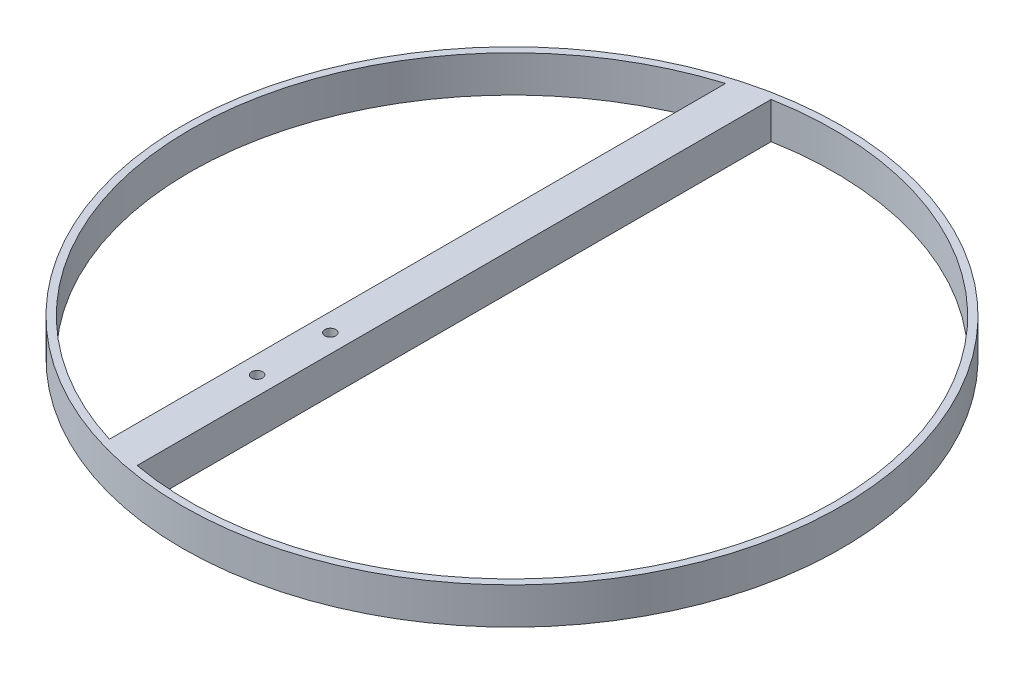
ISO-10303-21;
HEADER;
FILE_DESCRIPTION(('STEP AP214'),'2;1');
FILE_NAME('part.step','',(''),(''),'','','');
FILE_SCHEMA(('AUTOMOTIVE_DESIGN { 1 0 10303 214 1 1 1 1 }'));
ENDSEC;
DATA;
#1=APPLICATION_CONTEXT('core data for automotive mechanical design processes');
#2=APPLICATION_PROTOCOL_DEFINITION('international standard','automotive_design',2000,#1);
#3=PRODUCT_CONTEXT('',#1,'mechanical');
#4=PRODUCT('Part','Part','',(#3));
#5=PRODUCT_RELATED_PRODUCT_CATEGORY('part','',(#4));
#6=PRODUCT_DEFINITION_FORMATION('','',#4);
#7=PRODUCT_DEFINITION_CONTEXT('part definition',#1,'design');
#8=PRODUCT_DEFINITION('design','',#6,#7);
#9=PRODUCT_DEFINITION_SHAPE('','',#8);
#10=(LENGTH_UNIT() NAMED_UNIT(*) SI_UNIT(.MILLI.,.METRE.));
#11=(NAMED_UNIT(*) PLANE_ANGLE_UNIT() SI_UNIT($,.RADIAN.));
#12=(NAMED_UNIT(*) SI_UNIT($,.STERADIAN.) SOLID_ANGLE_UNIT());
#13=UNCERTAINTY_MEASURE_WITH_UNIT(LENGTH_MEASURE(1.E-05),#10,'distance_accuracy_value','');
#14=(GEOMETRIC_REPRESENTATION_CONTEXT(3) GLOBAL_UNCERTAINTY_ASSIGNED_CONTEXT((#13)) GLOBAL_UNIT_ASSIGNED_CONTEXT((#10,
#11,#12)) REPRESENTATION_CONTEXT('',''));
#15=CARTESIAN_POINT('',(0.,0.,0.));
#16=DIRECTION('',(0.,0.,1.));
#17=DIRECTION('',(1.,0.,0.));
#18=AXIS2_PLACEMENT_3D('',#15,#16,#17);
#19=CARTESIAN_POINT('',(3.87836429638355E-12,10.,-1.26472242022427E-11));
#20=DIRECTION('',(0.,1.,0.));
#21=DIRECTION('',(0.,0.,1.));
#22=AXIS2_PLACEMENT_3D('',#19,#20,#21);
#23=PLANE('',#22);
#24=DIRECTION('',(0.,0.,-1.));
#25=VECTOR('',#24,1.);
#26=CARTESIAN_POINT('',(-25.8,10.,-84.132989962321));
#27=LINE('',#26,#25);
#28=CARTESIAN_POINT('',(-25.8,10.,84.132989962321));
#29=VERTEX_POINT('',#28);
#30=CARTESIAN_POINT('',(-25.8,10.,-84.132989962321));
#31=VERTEX_POINT('',#30);
#32=EDGE_CURVE('E73',#29,#31,#27,.T.);
#33=ORIENTED_EDGE('',*,*,#32,.F.);
#34=CARTESIAN_POINT('',(0.,10.,0.));
#35=DIRECTION('',(0.,1.,0.));
#36=DIRECTION('',(0.,0.,1.));
#37=AXIS2_PLACEMENT_3D('',#34,#35,#36);
#38=CIRCLE('',#37,88.);
#39=EDGE_CURVE('E79',#31,#29,#38,.T.);
#40=ORIENTED_EDGE('',*,*,#39,.F.);
#41=EDGE_LOOP('',(#33,#40));
#42=FACE_BOUND('',#41,.T.);
#43=CARTESIAN_POINT('',(1.71522962499892E-11,10.,9.4081340828088E-11));
#44=DIRECTION('',(0.,1.,0.));
#45=DIRECTION('',(0.,0.,1.));
#46=AXIS2_PLACEMENT_3D('',#43,#44,#45);
#47=CIRCLE('',#46,88.000000000096);
#48=CARTESIAN_POINT('',(-15.8,10.,86.5699716991983));
#49=VERTEX_POINT('',#48);
#50=CARTESIAN_POINT('',(-15.8,10.,-86.5699716992018));
#51=VERTEX_POINT('',#50);
#52=EDGE_CURVE('E95',#49,#51,#47,.T.);
#53=ORIENTED_EDGE('',*,*,#52,.F.);
#54=DIRECTION('',(0.,0.,1.));
#55=VECTOR('',#54,1.);
#56=CARTESIAN_POINT('',(-15.8,10.,-86.5699716992018));
#57=LINE('',#56,#55);
#58=EDGE_CURVE('E97',#51,#49,#57,.T.);
#59=ORIENTED_EDGE('',*,*,#58,.F.);
#60=EDGE_LOOP('',(#53,#59));
#61=FACE_BOUND('',#60,.T.);
#62=CARTESIAN_POINT('',(-20.8334777536858,10.,28.7796900118174));
#63=DIRECTION('',(0.,1.,0.));
#64=DIRECTION('',(0.,0.,1.));
#65=AXIS2_PLACEMENT_3D('',#62,#63,#64);
#66=CIRCLE('',#65,1.5);
#67=CARTESIAN_POINT('',(-20.8334777536858,10.,30.2796900118174));
#68=VERTEX_POINT('',#67);
#69=EDGE_CURVE('E112',#68,#68,#66,.T.);
#70=ORIENTED_EDGE('',*,*,#69,.F.);
#71=EDGE_LOOP('',(#70));
#72=FACE_BOUND('',#71,.T.);
#73=CARTESIAN_POINT('',(3.87836429638355E-12,10.,-1.26472242022427E-11));
#74=DIRECTION('',(0.,1.,0.));
#75=DIRECTION('',(0.,0.,1.));
#76=AXIS2_PLACEMENT_3D('',#73,#74,#75);
#77=CIRCLE('',#76,89.9999999999884);
#78=CARTESIAN_POINT('',(3.87836429638355E-12,10.,89.9999999999758));
#79=VERTEX_POINT('',#78);
#80=EDGE_CURVE('E11',#79,#79,#77,.T.);
#81=ORIENTED_EDGE('',*,*,#80,.T.);
#82=EDGE_LOOP('',(#81));
#83=FACE_BOUND('',#82,.T.);
#84=CARTESIAN_POINT('',(-20.8334777536858,10.,48.7796900118174));
#85=DIRECTION('',(0.,1.,0.));
#86=DIRECTION('',(0.,0.,1.));
#87=AXIS2_PLACEMENT_3D('',#84,#85,#86);
#88=CIRCLE('',#87,1.5);
#89=CARTESIAN_POINT('',(-20.8334777536858,10.,50.2796900118174));
#90=VERTEX_POINT('',#89);
#91=EDGE_CURVE('E91',#90,#90,#88,.T.);
#92=ORIENTED_EDGE('',*,*,#91,.F.);
#93=EDGE_LOOP('',(#92));
#94=FACE_BOUND('',#93,.T.);
#95=ADVANCED_FACE('F33',(#42,#61,#72,#83,#94),#23,.T.);
#96=CARTESIAN_POINT('',(3.87836429638355E-12,0.,-1.26472242022427E-11));
#97=DIRECTION('',(0.,1.,0.));
#98=DIRECTION('',(0.,0.,1.));
#99=AXIS2_PLACEMENT_3D('',#96,#97,#98);
#100=PLANE('',#99);
#101=DIRECTION('',(0.,0.,1.));
#102=VECTOR('',#101,1.);
#103=CARTESIAN_POINT('',(-15.8,0.,-86.5699716992018));
#104=LINE('',#103,#102);
#105=CARTESIAN_POINT('',(-15.7999999999994,0.,-86.5699716991984));
#106=VERTEX_POINT('',#105);
#107=CARTESIAN_POINT('',(-15.8,0.,86.5699716991984));
#108=VERTEX_POINT('',#107);
#109=EDGE_CURVE('E94',#106,#108,#104,.T.);
#110=ORIENTED_EDGE('',*,*,#109,.T.);
#111=CARTESIAN_POINT('',(0.,0.,0.));
#112=DIRECTION('',(0.,1.,0.));
#113=DIRECTION('',(0.,0.,1.));
#114=AXIS2_PLACEMENT_3D('',#111,#112,#113);
#115=CIRCLE('',#114,88.);
#116=EDGE_CURVE('E98',#108,#106,#115,.T.);
#117=ORIENTED_EDGE('',*,*,#116,.T.);
#118=EDGE_LOOP('',(#110,#117));
#119=FACE_BOUND('',#118,.T.);
#120=CARTESIAN_POINT('',(3.87836429638355E-12,0.,-1.26472242022427E-11));
#121=DIRECTION('',(0.,1.,0.));
#122=DIRECTION('',(0.,0.,1.));
#123=AXIS2_PLACEMENT_3D('',#120,#121,#122);
#124=CIRCLE('',#123,89.9999999999884);
#125=CARTESIAN_POINT('',(3.87836429638355E-12,0.,89.9999999999758));
#126=VERTEX_POINT('',#125);
#127=EDGE_CURVE('E37',#126,#126,#124,.T.);
#128=ORIENTED_EDGE('',*,*,#127,.F.);
#129=EDGE_LOOP('',(#128));
#130=FACE_BOUND('',#129,.T.);
#131=CARTESIAN_POINT('',(-20.8334777536858,0.,28.7796900118174));
#132=DIRECTION('',(0.,1.,0.));
#133=DIRECTION('',(0.,0.,1.));
#134=AXIS2_PLACEMENT_3D('',#131,#132,#133);
#135=CIRCLE('',#134,1.5);
#136=CARTESIAN_POINT('',(-20.8334777536858,0.,30.2796900118174));
#137=VERTEX_POINT('',#136);
#138=EDGE_CURVE('E111',#137,#137,#135,.T.);
#139=ORIENTED_EDGE('',*,*,#138,.T.);
#140=EDGE_LOOP('',(#139));
#141=FACE_BOUND('',#140,.T.);
#142=CARTESIAN_POINT('',(0.,0.,0.));
#143=DIRECTION('',(0.,1.,0.));
#144=DIRECTION('',(0.,0.,1.));
#145=AXIS2_PLACEMENT_3D('',#142,#143,#144);
#146=CIRCLE('',#145,88.);
#147=CARTESIAN_POINT('',(-25.8,0.,-84.132989962321));
#148=VERTEX_POINT('',#147);
#149=CARTESIAN_POINT('',(-25.8,0.,84.132989962321));
#150=VERTEX_POINT('',#149);
#151=EDGE_CURVE('E55',#148,#150,#146,.T.);
#152=ORIENTED_EDGE('',*,*,#151,.T.);
#153=DIRECTION('',(0.,0.,-1.));
#154=VECTOR('',#153,1.);
#155=CARTESIAN_POINT('',(-25.8,0.,-84.132989962321));
#156=LINE('',#155,#154);
#157=EDGE_CURVE('E84',#150,#148,#156,.T.);
#158=ORIENTED_EDGE('',*,*,#157,.T.);
#159=EDGE_LOOP('',(#152,#158));
#160=FACE_BOUND('',#159,.T.);
#161=CARTESIAN_POINT('',(-20.8334777536858,0.,48.7796900118174));
#162=DIRECTION('',(0.,1.,0.));
#163=DIRECTION('',(0.,0.,1.));
#164=AXIS2_PLACEMENT_3D('',#161,#162,#163);
#165=CIRCLE('',#164,1.5);
#166=CARTESIAN_POINT('',(-20.8334777536858,0.,50.2796900118174));
#167=VERTEX_POINT('',#166);
#168=EDGE_CURVE('E88',#167,#167,#165,.T.);
#169=ORIENTED_EDGE('',*,*,#168,.T.);
#170=EDGE_LOOP('',(#169));
#171=FACE_BOUND('',#170,.T.);
#172=ADVANCED_FACE('F118',(#119,#130,#141,#160,#171),#100,.F.);
#173=CARTESIAN_POINT('',(3.87836429638355E-12,10.,-1.26472242022427E-11));
#174=DIRECTION('',(0.,-1.,0.));
#175=DIRECTION('',(0.,0.,-1.));
#176=AXIS2_PLACEMENT_3D('',#173,#174,#175);
#177=CYLINDRICAL_SURFACE('',#176,89.9999999999884);
#178=ORIENTED_EDGE('',*,*,#80,.F.);
#179=EDGE_LOOP('',(#178));
#180=FACE_BOUND('',#179,.T.);
#181=ORIENTED_EDGE('',*,*,#127,.T.);
#182=EDGE_LOOP('',(#181));
#183=FACE_BOUND('',#182,.T.);
#184=ADVANCED_FACE('F35',(#180,#183),#177,.T.);
#185=CARTESIAN_POINT('',(-20.8334777536858,10.,28.7796900118174));
#186=DIRECTION('',(0.,-1.,0.));
#187=DIRECTION('',(0.,0.,-1.));
#188=AXIS2_PLACEMENT_3D('',#185,#186,#187);
#189=CYLINDRICAL_SURFACE('',#188,1.5);
#190=ORIENTED_EDGE('',*,*,#69,.T.);
#191=EDGE_LOOP('',(#190));
#192=FACE_BOUND('',#191,.T.);
#193=ORIENTED_EDGE('',*,*,#138,.F.);
#194=EDGE_LOOP('',(#193));
#195=FACE_BOUND('',#194,.T.);
#196=ADVANCED_FACE('F121',(#192,#195),#189,.F.);
#197=CARTESIAN_POINT('',(-15.8,10.,-86.5699716992018));
#198=DIRECTION('',(1.,0.,0.));
#199=DIRECTION('',(0.,0.,-1.));
#200=AXIS2_PLACEMENT_3D('',#197,#198,#199);
#201=PLANE('',#200);
#202=ORIENTED_EDGE('',*,*,#109,.F.);
#203=DIRECTION('',(0.,-1.,0.));
#204=VECTOR('',#203,1.);
#205=CARTESIAN_POINT('',(-15.8,10.,-86.5699716992018));
#206=LINE('',#205,#204);
#207=EDGE_CURVE('E108',#51,#106,#206,.T.);
#208=ORIENTED_EDGE('',*,*,#207,.F.);
#209=ORIENTED_EDGE('',*,*,#58,.T.);
#210=DIRECTION('',(0.,-1.,0.));
#211=VECTOR('',#210,1.);
#212=CARTESIAN_POINT('',(-15.8,10.,86.5699716991984));
#213=LINE('',#212,#211);
#214=EDGE_CURVE('E101',#49,#108,#213,.T.);
#215=ORIENTED_EDGE('',*,*,#214,.T.);
#216=EDGE_LOOP('',(#202,#208,#209,#215));
#217=FACE_BOUND('',#216,.T.);
#218=ADVANCED_FACE('F123',(#217),#201,.T.);
#219=CARTESIAN_POINT('',(0.,10.,0.));
#220=DIRECTION('',(0.,-1.,0.));
#221=DIRECTION('',(0.,0.,-1.));
#222=AXIS2_PLACEMENT_3D('',#219,#220,#221);
#223=CYLINDRICAL_SURFACE('',#222,88.);
#224=ORIENTED_EDGE('',*,*,#116,.F.);
#225=ORIENTED_EDGE('',*,*,#214,.F.);
#226=ORIENTED_EDGE('',*,*,#52,.T.);
#227=ORIENTED_EDGE('',*,*,#207,.T.);
#228=EDGE_LOOP('',(#224,#225,#226,#227));
#229=FACE_BOUND('',#228,.T.);
#230=ADVANCED_FACE('F130',(#229),#223,.F.);
#231=CARTESIAN_POINT('',(0.,10.,0.));
#232=DIRECTION('',(0.,-1.,0.));
#233=DIRECTION('',(0.,0.,-1.));
#234=AXIS2_PLACEMENT_3D('',#231,#232,#233);
#235=CYLINDRICAL_SURFACE('',#234,88.);
#236=ORIENTED_EDGE('',*,*,#151,.F.);
#237=DIRECTION('',(0.,-1.,0.));
#238=VECTOR('',#237,1.);
#239=CARTESIAN_POINT('',(-25.8,10.,-84.132989962321));
#240=LINE('',#239,#238);
#241=EDGE_CURVE('E75',#31,#148,#240,.T.);
#242=ORIENTED_EDGE('',*,*,#241,.F.);
#243=ORIENTED_EDGE('',*,*,#39,.T.);
#244=DIRECTION('',(0.,-1.,0.));
#245=VECTOR('',#244,1.);
#246=CARTESIAN_POINT('',(-25.8,10.,84.132989962321));
#247=LINE('',#246,#245);
#248=EDGE_CURVE('E48',#29,#150,#247,.T.);
#249=ORIENTED_EDGE('',*,*,#248,.T.);
#250=EDGE_LOOP('',(#236,#242,#243,#249));
#251=FACE_BOUND('',#250,.T.);
#252=ADVANCED_FACE('F81',(#251),#235,.F.);
#253=CARTESIAN_POINT('',(-25.8,10.,-84.132989962321));
#254=DIRECTION('',(-1.,0.,0.));
#255=DIRECTION('',(0.,0.,1.));
#256=AXIS2_PLACEMENT_3D('',#253,#254,#255);
#257=PLANE('',#256);
#258=ORIENTED_EDGE('',*,*,#157,.F.);
#259=ORIENTED_EDGE('',*,*,#248,.F.);
#260=ORIENTED_EDGE('',*,*,#32,.T.);
#261=ORIENTED_EDGE('',*,*,#241,.T.);
#262=EDGE_LOOP('',(#258,#259,#260,#261));
#263=FACE_BOUND('',#262,.T.);
#264=ADVANCED_FACE('F74',(#263),#257,.T.);
#265=CARTESIAN_POINT('',(-20.8334777536858,10.,48.7796900118174));
#266=DIRECTION('',(0.,-1.,0.));
#267=DIRECTION('',(0.,0.,-1.));
#268=AXIS2_PLACEMENT_3D('',#265,#266,#267);
#269=CYLINDRICAL_SURFACE('',#268,1.5);
#270=ORIENTED_EDGE('',*,*,#91,.T.);
#271=EDGE_LOOP('',(#270));
#272=FACE_BOUND('',#271,.T.);
#273=ORIENTED_EDGE('',*,*,#168,.F.);
#274=EDGE_LOOP('',(#273));
#275=FACE_BOUND('',#274,.T.);
#276=ADVANCED_FACE('F162',(#272,#275),#269,.F.);
#277=CLOSED_SHELL('',(#95,#172,#184,#196,#218,#230,#252,#264,#276));
#278=MANIFOLD_SOLID_BREP('B2',#277);
#279=ADVANCED_BREP_SHAPE_REPRESENTATION('',(#18,#278),#14);
#280=SHAPE_DEFINITION_REPRESENTATION(#9,#279);
ENDSEC;
END-ISO-10303-21;
